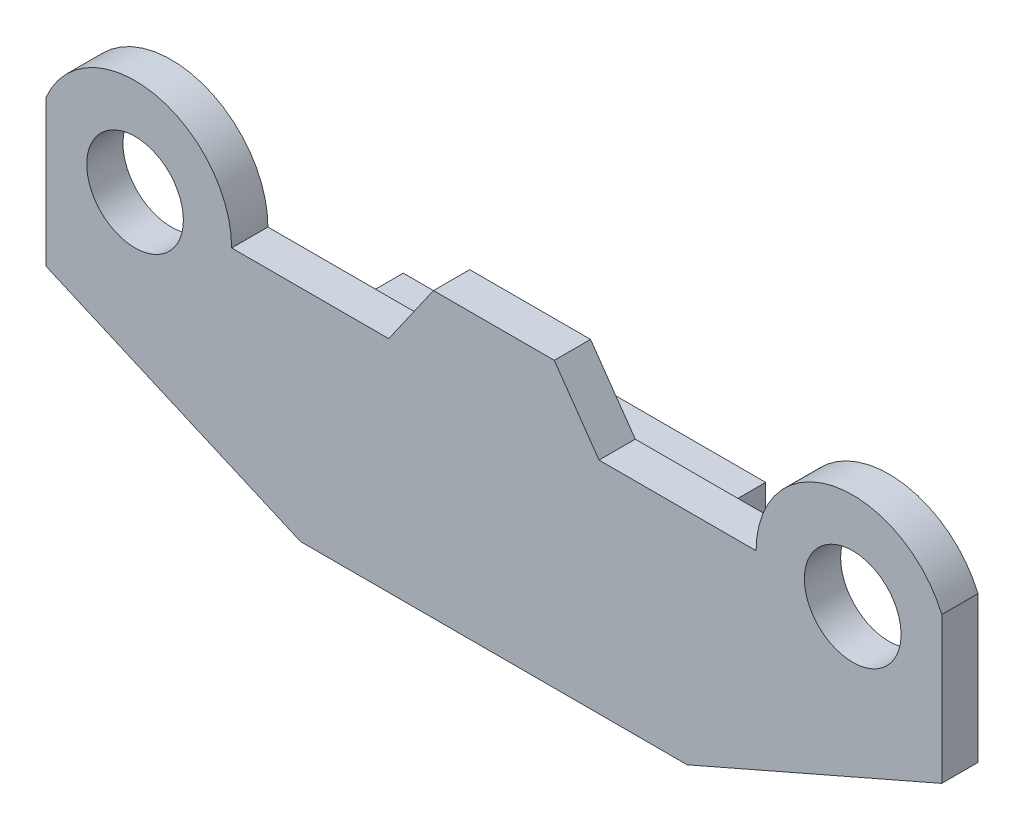
ISO-10303-21;
HEADER;
FILE_DESCRIPTION(('STEP AP214'),'2;1');
FILE_NAME('part.step','',(''),(''),'','','');
FILE_SCHEMA(('AUTOMOTIVE_DESIGN { 1 0 10303 214 1 1 1 1 }'));
ENDSEC;
DATA;
#1=APPLICATION_CONTEXT('core data for automotive mechanical design processes');
#2=APPLICATION_PROTOCOL_DEFINITION('international standard','automotive_design',2000,#1);
#3=PRODUCT_CONTEXT('',#1,'mechanical');
#4=PRODUCT('Part','Part','',(#3));
#5=PRODUCT_RELATED_PRODUCT_CATEGORY('part','',(#4));
#6=PRODUCT_DEFINITION_FORMATION('','',#4);
#7=PRODUCT_DEFINITION_CONTEXT('part definition',#1,'design');
#8=PRODUCT_DEFINITION('design','',#6,#7);
#9=PRODUCT_DEFINITION_SHAPE('','',#8);
#10=(LENGTH_UNIT() NAMED_UNIT(*) SI_UNIT(.MILLI.,.METRE.));
#11=(NAMED_UNIT(*) PLANE_ANGLE_UNIT() SI_UNIT($,.RADIAN.));
#12=(NAMED_UNIT(*) SI_UNIT($,.STERADIAN.) SOLID_ANGLE_UNIT());
#13=UNCERTAINTY_MEASURE_WITH_UNIT(LENGTH_MEASURE(1.E-05),#10,'distance_accuracy_value','');
#14=(GEOMETRIC_REPRESENTATION_CONTEXT(3) GLOBAL_UNCERTAINTY_ASSIGNED_CONTEXT((#13)) GLOBAL_UNIT_ASSIGNED_CONTEXT((#10,
#11,#12)) REPRESENTATION_CONTEXT('',''));
#15=CARTESIAN_POINT('',(0.,0.,0.));
#16=DIRECTION('',(0.,0.,1.));
#17=DIRECTION('',(1.,0.,0.));
#18=AXIS2_PLACEMENT_3D('',#15,#16,#17);
#19=CARTESIAN_POINT('',(-29.7060182427894,0.,3.));
#20=DIRECTION('',(0.,0.,1.));
#21=DIRECTION('',(1.,0.,0.));
#22=AXIS2_PLACEMENT_3D('',#19,#20,#21);
#23=PLANE('',#22);
#24=CARTESIAN_POINT('',(-29.7060182427894,0.,3.));
#25=DIRECTION('',(0.,0.,1.));
#26=DIRECTION('',(1.,0.,0.));
#27=AXIS2_PLACEMENT_3D('',#24,#25,#26);
#28=CIRCLE('',#27,4.);
#29=CARTESIAN_POINT('',(-25.7060182427894,0.,3.));
#30=VERTEX_POINT('',#29);
#31=EDGE_CURVE('E170',#30,#30,#28,.T.);
#32=ORIENTED_EDGE('',*,*,#31,.F.);
#33=EDGE_LOOP('',(#32));
#34=FACE_BOUND('',#33,.T.);
#35=CARTESIAN_POINT('',(-29.7060182427894,0.,3.));
#36=DIRECTION('',(0.,0.,1.));
#37=DIRECTION('',(1.,0.,0.));
#38=AXIS2_PLACEMENT_3D('',#35,#36,#37);
#39=CIRCLE('',#38,8.);
#40=CARTESIAN_POINT('',(-21.7060182427894,0.,3.));
#41=VERTEX_POINT('',#40);
#42=CARTESIAN_POINT('',(-37.0773842564028,3.10853069686384,3.));
#43=VERTEX_POINT('',#42);
#44=EDGE_CURVE('E190',#41,#43,#39,.T.);
#45=ORIENTED_EDGE('',*,*,#44,.T.);
#46=DIRECTION('',(0.,-1.,0.));
#47=VECTOR('',#46,1.);
#48=CARTESIAN_POINT('',(-37.0773842564028,3.10853069686384,3.));
#49=LINE('',#48,#47);
#50=CARTESIAN_POINT('',(-37.0773842564028,-8.99435646421489,3.));
#51=VERTEX_POINT('',#50);
#52=EDGE_CURVE('E110',#43,#51,#49,.T.);
#53=ORIENTED_EDGE('',*,*,#52,.T.);
#54=DIRECTION('',(0.916408011147949,-0.400245371121092,0.));
#55=VECTOR('',#54,1.);
#56=CARTESIAN_POINT('',(-37.0773842564028,-8.99435646421489,3.));
#57=LINE('',#56,#55);
#58=CARTESIAN_POINT('',(-16.,-18.2,3.));
#59=VERTEX_POINT('',#58);
#60=EDGE_CURVE('E217',#51,#59,#57,.T.);
#61=ORIENTED_EDGE('',*,*,#60,.T.);
#62=DIRECTION('',(1.,0.,0.));
#63=VECTOR('',#62,1.);
#64=CARTESIAN_POINT('',(-16.,-18.2,3.));
#65=LINE('',#64,#63);
#66=CARTESIAN_POINT('',(16.,-18.2,3.));
#67=VERTEX_POINT('',#66);
#68=EDGE_CURVE('E236',#59,#67,#65,.T.);
#69=ORIENTED_EDGE('',*,*,#68,.T.);
#70=DIRECTION('',(0.916408011147949,0.400245371121092,0.));
#71=VECTOR('',#70,1.);
#72=CARTESIAN_POINT('',(37.0773842564028,-8.99435646421489,3.));
#73=LINE('',#72,#71);
#74=CARTESIAN_POINT('',(37.0773842564028,-8.99435646421489,3.));
#75=VERTEX_POINT('',#74);
#76=EDGE_CURVE('E233',#67,#75,#73,.T.);
#77=ORIENTED_EDGE('',*,*,#76,.T.);
#78=DIRECTION('',(0.,1.,0.));
#79=VECTOR('',#78,1.);
#80=CARTESIAN_POINT('',(37.0773842564028,3.10853069686384,3.));
#81=LINE('',#80,#79);
#82=CARTESIAN_POINT('',(37.0773842564028,3.10853069686384,3.));
#83=VERTEX_POINT('',#82);
#84=EDGE_CURVE('E235',#75,#83,#81,.T.);
#85=ORIENTED_EDGE('',*,*,#84,.T.);
#86=CARTESIAN_POINT('',(29.7060182427894,0.,3.));
#87=DIRECTION('',(0.,0.,1.));
#88=DIRECTION('',(-1.,0.,0.));
#89=AXIS2_PLACEMENT_3D('',#86,#87,#88);
#90=CIRCLE('',#89,8.);
#91=CARTESIAN_POINT('',(21.7060182427894,0.,3.));
#92=VERTEX_POINT('',#91);
#93=EDGE_CURVE('E238',#83,#92,#90,.T.);
#94=ORIENTED_EDGE('',*,*,#93,.T.);
#95=DIRECTION('',(-1.,0.,0.));
#96=VECTOR('',#95,1.);
#97=CARTESIAN_POINT('',(21.7060182427894,0.,3.));
#98=LINE('',#97,#96);
#99=CARTESIAN_POINT('',(8.70601824278939,0.,3.));
#100=VERTEX_POINT('',#99);
#101=EDGE_CURVE('E244',#92,#100,#98,.T.);
#102=ORIENTED_EDGE('',*,*,#101,.T.);
#103=DIRECTION('',(-0.573049059575469,0.819521064597897,0.));
#104=VECTOR('',#103,1.);
#105=CARTESIAN_POINT('',(8.70601824278939,0.,3.));
#106=LINE('',#105,#104);
#107=CARTESIAN_POINT('',(5.,5.3,3.));
#108=VERTEX_POINT('',#107);
#109=EDGE_CURVE('E145',#100,#108,#106,.T.);
#110=ORIENTED_EDGE('',*,*,#109,.T.);
#111=DIRECTION('',(-1.,0.,0.));
#112=VECTOR('',#111,1.);
#113=CARTESIAN_POINT('',(-5.,5.3,3.));
#114=LINE('',#113,#112);
#115=CARTESIAN_POINT('',(-5.,5.3,3.));
#116=VERTEX_POINT('',#115);
#117=EDGE_CURVE('E138',#108,#116,#114,.T.);
#118=ORIENTED_EDGE('',*,*,#117,.T.);
#119=DIRECTION('',(-0.573049059575469,-0.819521064597897,0.));
#120=VECTOR('',#119,1.);
#121=CARTESIAN_POINT('',(-8.70601824278939,0.,3.));
#122=LINE('',#121,#120);
#123=CARTESIAN_POINT('',(-8.70601824278939,0.,3.));
#124=VERTEX_POINT('',#123);
#125=EDGE_CURVE('E142',#116,#124,#122,.T.);
#126=ORIENTED_EDGE('',*,*,#125,.T.);
#127=DIRECTION('',(-1.,0.,0.));
#128=VECTOR('',#127,1.);
#129=CARTESIAN_POINT('',(-21.7060182427894,0.,3.));
#130=LINE('',#129,#128);
#131=EDGE_CURVE('E57',#124,#41,#130,.T.);
#132=ORIENTED_EDGE('',*,*,#131,.T.);
#133=EDGE_LOOP('',(#45,#53,#61,#69,#77,#85,#94,#102,#110,#118,#126,#132));
#134=FACE_BOUND('',#133,.T.);
#135=CARTESIAN_POINT('',(29.7060182427894,0.,3.));
#136=DIRECTION('',(0.,0.,1.));
#137=DIRECTION('',(-1.,0.,0.));
#138=AXIS2_PLACEMENT_3D('',#135,#136,#137);
#139=CIRCLE('',#138,4.);
#140=CARTESIAN_POINT('',(25.7060182427894,0.,3.));
#141=VERTEX_POINT('',#140);
#142=EDGE_CURVE('E265',#141,#141,#139,.T.);
#143=ORIENTED_EDGE('',*,*,#142,.F.);
#144=EDGE_LOOP('',(#143));
#145=FACE_BOUND('',#144,.T.);
#146=ADVANCED_FACE('F33',(#34,#134,#145),#23,.T.);
#147=CARTESIAN_POINT('',(-29.7060182427894,0.,0.));
#148=DIRECTION('',(0.,0.,1.));
#149=DIRECTION('',(1.,0.,0.));
#150=AXIS2_PLACEMENT_3D('',#147,#148,#149);
#151=PLANE('',#150);
#152=DIRECTION('',(1.,0.,0.));
#153=VECTOR('',#152,1.);
#154=CARTESIAN_POINT('',(15.,-17.2,0.));
#155=LINE('',#154,#153);
#156=CARTESIAN_POINT('',(-15.,-17.2,0.));
#157=VERTEX_POINT('',#156);
#158=CARTESIAN_POINT('',(15.,-17.2,0.));
#159=VERTEX_POINT('',#158);
#160=EDGE_CURVE('E284',#157,#159,#155,.T.);
#161=ORIENTED_EDGE('',*,*,#160,.T.);
#162=DIRECTION('',(0.,1.,0.));
#163=VECTOR('',#162,1.);
#164=CARTESIAN_POINT('',(15.,-2.2,0.));
#165=LINE('',#164,#163);
#166=CARTESIAN_POINT('',(15.,-2.2,0.));
#167=VERTEX_POINT('',#166);
#168=EDGE_CURVE('E292',#159,#167,#165,.T.);
#169=ORIENTED_EDGE('',*,*,#168,.T.);
#170=DIRECTION('',(-1.,0.,0.));
#171=VECTOR('',#170,1.);
#172=CARTESIAN_POINT('',(15.,-2.2,0.));
#173=LINE('',#172,#171);
#174=CARTESIAN_POINT('',(-15.,-2.2,0.));
#175=VERTEX_POINT('',#174);
#176=EDGE_CURVE('E289',#167,#175,#173,.T.);
#177=ORIENTED_EDGE('',*,*,#176,.T.);
#178=DIRECTION('',(0.,-1.,0.));
#179=VECTOR('',#178,1.);
#180=CARTESIAN_POINT('',(-15.,-2.2,0.));
#181=LINE('',#180,#179);
#182=EDGE_CURVE('E48',#175,#157,#181,.T.);
#183=ORIENTED_EDGE('',*,*,#182,.T.);
#184=EDGE_LOOP('',(#161,#169,#177,#183));
#185=FACE_BOUND('',#184,.T.);
#186=CARTESIAN_POINT('',(-29.7060182427894,0.,0.));
#187=DIRECTION('',(0.,0.,1.));
#188=DIRECTION('',(1.,0.,0.));
#189=AXIS2_PLACEMENT_3D('',#186,#187,#188);
#190=CIRCLE('',#189,8.);
#191=CARTESIAN_POINT('',(-21.7060182427894,0.,0.));
#192=VERTEX_POINT('',#191);
#193=CARTESIAN_POINT('',(-37.0773842564028,3.10853069686384,0.));
#194=VERTEX_POINT('',#193);
#195=EDGE_CURVE('E166',#192,#194,#190,.T.);
#196=ORIENTED_EDGE('',*,*,#195,.F.);
#197=DIRECTION('',(-1.,0.,0.));
#198=VECTOR('',#197,1.);
#199=CARTESIAN_POINT('',(-21.7060182427894,0.,0.));
#200=LINE('',#199,#198);
#201=CARTESIAN_POINT('',(-8.70601824278939,0.,0.));
#202=VERTEX_POINT('',#201);
#203=EDGE_CURVE('E102',#202,#192,#200,.T.);
#204=ORIENTED_EDGE('',*,*,#203,.F.);
#205=DIRECTION('',(-0.573049059575469,-0.819521064597897,0.));
#206=VECTOR('',#205,1.);
#207=CARTESIAN_POINT('',(-8.70601824278939,0.,0.));
#208=LINE('',#207,#206);
#209=CARTESIAN_POINT('',(-5.,5.3,0.));
#210=VERTEX_POINT('',#209);
#211=EDGE_CURVE('E187',#210,#202,#208,.T.);
#212=ORIENTED_EDGE('',*,*,#211,.F.);
#213=DIRECTION('',(-1.,0.,0.));
#214=VECTOR('',#213,1.);
#215=CARTESIAN_POINT('',(-5.,5.3,0.));
#216=LINE('',#215,#214);
#217=CARTESIAN_POINT('',(5.,5.3,0.));
#218=VERTEX_POINT('',#217);
#219=EDGE_CURVE('E154',#218,#210,#216,.T.);
#220=ORIENTED_EDGE('',*,*,#219,.F.);
#221=DIRECTION('',(-0.573049059575469,0.819521064597897,0.));
#222=VECTOR('',#221,1.);
#223=CARTESIAN_POINT('',(8.70601824278939,0.,0.));
#224=LINE('',#223,#222);
#225=CARTESIAN_POINT('',(8.70601824278939,0.,0.));
#226=VERTEX_POINT('',#225);
#227=EDGE_CURVE('E184',#226,#218,#224,.T.);
#228=ORIENTED_EDGE('',*,*,#227,.F.);
#229=DIRECTION('',(-1.,0.,0.));
#230=VECTOR('',#229,1.);
#231=CARTESIAN_POINT('',(21.7060182427894,0.,0.));
#232=LINE('',#231,#230);
#233=CARTESIAN_POINT('',(21.7060182427894,0.,0.));
#234=VERTEX_POINT('',#233);
#235=EDGE_CURVE('E182',#234,#226,#232,.T.);
#236=ORIENTED_EDGE('',*,*,#235,.F.);
#237=CARTESIAN_POINT('',(29.7060182427894,0.,0.));
#238=DIRECTION('',(0.,0.,1.));
#239=DIRECTION('',(-1.,0.,0.));
#240=AXIS2_PLACEMENT_3D('',#237,#238,#239);
#241=CIRCLE('',#240,8.);
#242=CARTESIAN_POINT('',(37.0773842564028,3.10853069686384,0.));
#243=VERTEX_POINT('',#242);
#244=EDGE_CURVE('E180',#243,#234,#241,.T.);
#245=ORIENTED_EDGE('',*,*,#244,.F.);
#246=DIRECTION('',(0.,1.,0.));
#247=VECTOR('',#246,1.);
#248=CARTESIAN_POINT('',(37.0773842564028,3.10853069686384,0.));
#249=LINE('',#248,#247);
#250=CARTESIAN_POINT('',(37.0773842564028,-8.99435646421489,0.));
#251=VERTEX_POINT('',#250);
#252=EDGE_CURVE('E178',#251,#243,#249,.T.);
#253=ORIENTED_EDGE('',*,*,#252,.F.);
#254=DIRECTION('',(0.916408011147949,0.400245371121092,0.));
#255=VECTOR('',#254,1.);
#256=CARTESIAN_POINT('',(37.0773842564028,-8.99435646421489,0.));
#257=LINE('',#256,#255);
#258=CARTESIAN_POINT('',(16.,-18.2,0.));
#259=VERTEX_POINT('',#258);
#260=EDGE_CURVE('E176',#259,#251,#257,.T.);
#261=ORIENTED_EDGE('',*,*,#260,.F.);
#262=DIRECTION('',(1.,0.,0.));
#263=VECTOR('',#262,1.);
#264=CARTESIAN_POINT('',(-16.,-18.2,0.));
#265=LINE('',#264,#263);
#266=CARTESIAN_POINT('',(-16.,-18.2,0.));
#267=VERTEX_POINT('',#266);
#268=EDGE_CURVE('E174',#267,#259,#265,.T.);
#269=ORIENTED_EDGE('',*,*,#268,.F.);
#270=DIRECTION('',(0.916408011147949,-0.400245371121092,0.));
#271=VECTOR('',#270,1.);
#272=CARTESIAN_POINT('',(-37.0773842564028,-8.99435646421489,0.));
#273=LINE('',#272,#271);
#274=CARTESIAN_POINT('',(-37.0773842564028,-8.99435646421489,0.));
#275=VERTEX_POINT('',#274);
#276=EDGE_CURVE('E172',#275,#267,#273,.T.);
#277=ORIENTED_EDGE('',*,*,#276,.F.);
#278=DIRECTION('',(0.,-1.,0.));
#279=VECTOR('',#278,1.);
#280=CARTESIAN_POINT('',(-37.0773842564028,3.10853069686384,0.));
#281=LINE('',#280,#279);
#282=EDGE_CURVE('E169',#194,#275,#281,.T.);
#283=ORIENTED_EDGE('',*,*,#282,.F.);
#284=EDGE_LOOP('',(#196,#204,#212,#220,#228,#236,#245,#253,#261,#269,#277,#283));
#285=FACE_BOUND('',#284,.T.);
#286=CARTESIAN_POINT('',(-29.7060182427894,0.,0.));
#287=DIRECTION('',(0.,0.,1.));
#288=DIRECTION('',(1.,0.,0.));
#289=AXIS2_PLACEMENT_3D('',#286,#287,#288);
#290=CIRCLE('',#289,4.);
#291=CARTESIAN_POINT('',(-25.7060182427894,0.,0.));
#292=VERTEX_POINT('',#291);
#293=EDGE_CURVE('E262',#292,#292,#290,.T.);
#294=ORIENTED_EDGE('',*,*,#293,.T.);
#295=EDGE_LOOP('',(#294));
#296=FACE_BOUND('',#295,.T.);
#297=CARTESIAN_POINT('',(29.7060182427894,0.,0.));
#298=DIRECTION('',(0.,0.,1.));
#299=DIRECTION('',(-1.,0.,0.));
#300=AXIS2_PLACEMENT_3D('',#297,#298,#299);
#301=CIRCLE('',#300,4.);
#302=CARTESIAN_POINT('',(25.7060182427894,0.,0.));
#303=VERTEX_POINT('',#302);
#304=EDGE_CURVE('E268',#303,#303,#301,.T.);
#305=ORIENTED_EDGE('',*,*,#304,.T.);
#306=EDGE_LOOP('',(#305));
#307=FACE_BOUND('',#306,.T.);
#308=ADVANCED_FACE('F221',(#185,#285,#296,#307),#151,.F.);
#309=CARTESIAN_POINT('',(-29.7060182427894,0.,3.));
#310=DIRECTION('',(0.,0.,-1.));
#311=DIRECTION('',(-1.,0.,0.));
#312=AXIS2_PLACEMENT_3D('',#309,#310,#311);
#313=CYLINDRICAL_SURFACE('',#312,8.);
#314=ORIENTED_EDGE('',*,*,#195,.T.);
#315=DIRECTION('',(0.,0.,-1.));
#316=VECTOR('',#315,1.);
#317=CARTESIAN_POINT('',(-37.0773842564028,3.10853069686384,3.));
#318=LINE('',#317,#316);
#319=EDGE_CURVE('E11',#43,#194,#318,.T.);
#320=ORIENTED_EDGE('',*,*,#319,.F.);
#321=ORIENTED_EDGE('',*,*,#44,.F.);
#322=DIRECTION('',(0.,0.,-1.));
#323=VECTOR('',#322,1.);
#324=CARTESIAN_POINT('',(-21.7060182427894,0.,3.));
#325=LINE('',#324,#323);
#326=EDGE_CURVE('E162',#41,#192,#325,.T.);
#327=ORIENTED_EDGE('',*,*,#326,.T.);
#328=EDGE_LOOP('',(#314,#320,#321,#327));
#329=FACE_BOUND('',#328,.T.);
#330=ADVANCED_FACE('F35',(#329),#313,.T.);
#331=CARTESIAN_POINT('',(-37.0773842564028,3.10853069686384,3.));
#332=DIRECTION('',(1.,0.,0.));
#333=DIRECTION('',(0.,0.,-1.));
#334=AXIS2_PLACEMENT_3D('',#331,#332,#333);
#335=PLANE('',#334);
#336=ORIENTED_EDGE('',*,*,#282,.T.);
#337=DIRECTION('',(0.,0.,-1.));
#338=VECTOR('',#337,1.);
#339=CARTESIAN_POINT('',(-37.0773842564028,-8.99435646421489,3.));
#340=LINE('',#339,#338);
#341=EDGE_CURVE('E41',#51,#275,#340,.T.);
#342=ORIENTED_EDGE('',*,*,#341,.F.);
#343=ORIENTED_EDGE('',*,*,#52,.F.);
#344=ORIENTED_EDGE('',*,*,#319,.T.);
#345=EDGE_LOOP('',(#336,#342,#343,#344));
#346=FACE_BOUND('',#345,.T.);
#347=ADVANCED_FACE('F340',(#346),#335,.F.);
#348=CARTESIAN_POINT('',(-37.0773842564028,-8.99435646421489,3.));
#349=DIRECTION('',(0.400245371121092,0.916408011147949,0.));
#350=DIRECTION('',(-0.916408011147949,0.400245371121092,0.));
#351=AXIS2_PLACEMENT_3D('',#348,#349,#350);
#352=PLANE('',#351);
#353=ORIENTED_EDGE('',*,*,#276,.T.);
#354=DIRECTION('',(0.,0.,-1.));
#355=VECTOR('',#354,1.);
#356=CARTESIAN_POINT('',(-16.,-18.2,3.));
#357=LINE('',#356,#355);
#358=EDGE_CURVE('E209',#59,#267,#357,.T.);
#359=ORIENTED_EDGE('',*,*,#358,.F.);
#360=ORIENTED_EDGE('',*,*,#60,.F.);
#361=ORIENTED_EDGE('',*,*,#341,.T.);
#362=EDGE_LOOP('',(#353,#359,#360,#361));
#363=FACE_BOUND('',#362,.T.);
#364=ADVANCED_FACE('F215',(#363),#352,.F.);
#365=CARTESIAN_POINT('',(-16.,-18.2,3.));
#366=DIRECTION('',(0.,1.,0.));
#367=DIRECTION('',(0.,0.,1.));
#368=AXIS2_PLACEMENT_3D('',#365,#366,#367);
#369=PLANE('',#368);
#370=ORIENTED_EDGE('',*,*,#268,.T.);
#371=DIRECTION('',(0.,0.,-1.));
#372=VECTOR('',#371,1.);
#373=CARTESIAN_POINT('',(16.,-18.2,3.));
#374=LINE('',#373,#372);
#375=EDGE_CURVE('E206',#67,#259,#374,.T.);
#376=ORIENTED_EDGE('',*,*,#375,.F.);
#377=ORIENTED_EDGE('',*,*,#68,.F.);
#378=ORIENTED_EDGE('',*,*,#358,.T.);
#379=EDGE_LOOP('',(#370,#376,#377,#378));
#380=FACE_BOUND('',#379,.T.);
#381=ADVANCED_FACE('F227',(#380),#369,.F.);
#382=CARTESIAN_POINT('',(37.0773842564028,-8.99435646421489,3.));
#383=DIRECTION('',(-0.400245371121092,0.916408011147949,0.));
#384=DIRECTION('',(-0.916408011147949,-0.400245371121092,0.));
#385=AXIS2_PLACEMENT_3D('',#382,#383,#384);
#386=PLANE('',#385);
#387=ORIENTED_EDGE('',*,*,#260,.T.);
#388=DIRECTION('',(0.,0.,-1.));
#389=VECTOR('',#388,1.);
#390=CARTESIAN_POINT('',(37.0773842564028,-8.99435646421489,3.));
#391=LINE('',#390,#389);
#392=EDGE_CURVE('E203',#75,#251,#391,.T.);
#393=ORIENTED_EDGE('',*,*,#392,.F.);
#394=ORIENTED_EDGE('',*,*,#76,.F.);
#395=ORIENTED_EDGE('',*,*,#375,.T.);
#396=EDGE_LOOP('',(#387,#393,#394,#395));
#397=FACE_BOUND('',#396,.T.);
#398=ADVANCED_FACE('F231',(#397),#386,.F.);
#399=CARTESIAN_POINT('',(37.0773842564028,3.10853069686384,3.));
#400=DIRECTION('',(-1.,0.,0.));
#401=DIRECTION('',(0.,0.,1.));
#402=AXIS2_PLACEMENT_3D('',#399,#400,#401);
#403=PLANE('',#402);
#404=ORIENTED_EDGE('',*,*,#252,.T.);
#405=DIRECTION('',(0.,0.,-1.));
#406=VECTOR('',#405,1.);
#407=CARTESIAN_POINT('',(37.0773842564028,3.10853069686384,3.));
#408=LINE('',#407,#406);
#409=EDGE_CURVE('E200',#83,#243,#408,.T.);
#410=ORIENTED_EDGE('',*,*,#409,.F.);
#411=ORIENTED_EDGE('',*,*,#84,.F.);
#412=ORIENTED_EDGE('',*,*,#392,.T.);
#413=EDGE_LOOP('',(#404,#410,#411,#412));
#414=FACE_BOUND('',#413,.T.);
#415=ADVANCED_FACE('F359',(#414),#403,.F.);
#416=CARTESIAN_POINT('',(29.7060182427894,0.,3.));
#417=DIRECTION('',(0.,0.,-1.));
#418=DIRECTION('',(-1.,0.,0.));
#419=AXIS2_PLACEMENT_3D('',#416,#417,#418);
#420=CYLINDRICAL_SURFACE('',#419,8.);
#421=ORIENTED_EDGE('',*,*,#244,.T.);
#422=DIRECTION('',(0.,0.,-1.));
#423=VECTOR('',#422,1.);
#424=CARTESIAN_POINT('',(21.7060182427894,0.,3.));
#425=LINE('',#424,#423);
#426=EDGE_CURVE('E197',#92,#234,#425,.T.);
#427=ORIENTED_EDGE('',*,*,#426,.F.);
#428=ORIENTED_EDGE('',*,*,#93,.F.);
#429=ORIENTED_EDGE('',*,*,#409,.T.);
#430=EDGE_LOOP('',(#421,#427,#428,#429));
#431=FACE_BOUND('',#430,.T.);
#432=ADVANCED_FACE('F356',(#431),#420,.T.);
#433=CARTESIAN_POINT('',(21.7060182427894,0.,3.));
#434=DIRECTION('',(0.,-1.,0.));
#435=DIRECTION('',(0.,0.,-1.));
#436=AXIS2_PLACEMENT_3D('',#433,#434,#435);
#437=PLANE('',#436);
#438=ORIENTED_EDGE('',*,*,#235,.T.);
#439=DIRECTION('',(0.,0.,-1.));
#440=VECTOR('',#439,1.);
#441=CARTESIAN_POINT('',(8.70601824278939,0.,3.));
#442=LINE('',#441,#440);
#443=EDGE_CURVE('E194',#100,#226,#442,.T.);
#444=ORIENTED_EDGE('',*,*,#443,.F.);
#445=ORIENTED_EDGE('',*,*,#101,.F.);
#446=ORIENTED_EDGE('',*,*,#426,.T.);
#447=EDGE_LOOP('',(#438,#444,#445,#446));
#448=FACE_BOUND('',#447,.T.);
#449=ADVANCED_FACE('F250',(#448),#437,.F.);
#450=CARTESIAN_POINT('',(8.70601824278939,0.,3.));
#451=DIRECTION('',(-0.819521064597897,-0.573049059575469,0.));
#452=DIRECTION('',(0.573049059575469,-0.819521064597897,0.));
#453=AXIS2_PLACEMENT_3D('',#450,#451,#452);
#454=PLANE('',#453);
#455=ORIENTED_EDGE('',*,*,#227,.T.);
#456=DIRECTION('',(0.,0.,-1.));
#457=VECTOR('',#456,1.);
#458=CARTESIAN_POINT('',(5.,5.3,3.));
#459=LINE('',#458,#457);
#460=EDGE_CURVE('E157',#108,#218,#459,.T.);
#461=ORIENTED_EDGE('',*,*,#460,.F.);
#462=ORIENTED_EDGE('',*,*,#109,.F.);
#463=ORIENTED_EDGE('',*,*,#443,.T.);
#464=EDGE_LOOP('',(#455,#461,#462,#463));
#465=FACE_BOUND('',#464,.T.);
#466=ADVANCED_FACE('F254',(#465),#454,.F.);
#467=CARTESIAN_POINT('',(-5.,5.3,3.));
#468=DIRECTION('',(0.,-1.,0.));
#469=DIRECTION('',(0.,0.,-1.));
#470=AXIS2_PLACEMENT_3D('',#467,#468,#469);
#471=PLANE('',#470);
#472=ORIENTED_EDGE('',*,*,#219,.T.);
#473=DIRECTION('',(0.,0.,-1.));
#474=VECTOR('',#473,1.);
#475=CARTESIAN_POINT('',(-5.,5.3,3.));
#476=LINE('',#475,#474);
#477=EDGE_CURVE('E151',#116,#210,#476,.T.);
#478=ORIENTED_EDGE('',*,*,#477,.F.);
#479=ORIENTED_EDGE('',*,*,#117,.F.);
#480=ORIENTED_EDGE('',*,*,#460,.T.);
#481=EDGE_LOOP('',(#472,#478,#479,#480));
#482=FACE_BOUND('',#481,.T.);
#483=ADVANCED_FACE('F152',(#482),#471,.F.);
#484=CARTESIAN_POINT('',(-8.70601824278939,0.,3.));
#485=DIRECTION('',(0.819521064597897,-0.573049059575469,0.));
#486=DIRECTION('',(0.573049059575469,0.819521064597897,0.));
#487=AXIS2_PLACEMENT_3D('',#484,#485,#486);
#488=PLANE('',#487);
#489=ORIENTED_EDGE('',*,*,#211,.T.);
#490=DIRECTION('',(0.,0.,-1.));
#491=VECTOR('',#490,1.);
#492=CARTESIAN_POINT('',(-8.70601824278939,0.,3.));
#493=LINE('',#492,#491);
#494=EDGE_CURVE('E158',#124,#202,#493,.T.);
#495=ORIENTED_EDGE('',*,*,#494,.F.);
#496=ORIENTED_EDGE('',*,*,#125,.F.);
#497=ORIENTED_EDGE('',*,*,#477,.T.);
#498=EDGE_LOOP('',(#489,#495,#496,#497));
#499=FACE_BOUND('',#498,.T.);
#500=ADVANCED_FACE('F160',(#499),#488,.F.);
#501=CARTESIAN_POINT('',(-21.7060182427894,0.,3.));
#502=DIRECTION('',(0.,-1.,0.));
#503=DIRECTION('',(0.,0.,-1.));
#504=AXIS2_PLACEMENT_3D('',#501,#502,#503);
#505=PLANE('',#504);
#506=ORIENTED_EDGE('',*,*,#203,.T.);
#507=ORIENTED_EDGE('',*,*,#326,.F.);
#508=ORIENTED_EDGE('',*,*,#131,.F.);
#509=ORIENTED_EDGE('',*,*,#494,.T.);
#510=EDGE_LOOP('',(#506,#507,#508,#509));
#511=FACE_BOUND('',#510,.T.);
#512=ADVANCED_FACE('F255',(#511),#505,.F.);
#513=CARTESIAN_POINT('',(-29.7060182427894,0.,3.));
#514=DIRECTION('',(0.,0.,-1.));
#515=DIRECTION('',(-1.,0.,0.));
#516=AXIS2_PLACEMENT_3D('',#513,#514,#515);
#517=CYLINDRICAL_SURFACE('',#516,4.);
#518=ORIENTED_EDGE('',*,*,#31,.T.);
#519=EDGE_LOOP('',(#518));
#520=FACE_BOUND('',#519,.T.);
#521=ORIENTED_EDGE('',*,*,#293,.F.);
#522=EDGE_LOOP('',(#521));
#523=FACE_BOUND('',#522,.T.);
#524=ADVANCED_FACE('F347',(#520,#523),#517,.F.);
#525=CARTESIAN_POINT('',(29.7060182427894,0.,3.));
#526=DIRECTION('',(0.,0.,-1.));
#527=DIRECTION('',(-1.,0.,0.));
#528=AXIS2_PLACEMENT_3D('',#525,#526,#527);
#529=CYLINDRICAL_SURFACE('',#528,4.);
#530=ORIENTED_EDGE('',*,*,#142,.T.);
#531=EDGE_LOOP('',(#530));
#532=FACE_BOUND('',#531,.T.);
#533=ORIENTED_EDGE('',*,*,#304,.F.);
#534=EDGE_LOOP('',(#533));
#535=FACE_BOUND('',#534,.T.);
#536=ADVANCED_FACE('F420',(#532,#535),#529,.F.);
#537=CARTESIAN_POINT('',(15.,-2.2,-4.5));
#538=DIRECTION('',(1.,0.,0.));
#539=DIRECTION('',(0.,1.,0.));
#540=AXIS2_PLACEMENT_3D('',#537,#538,#539);
#541=PLANE('',#540);
#542=ORIENTED_EDGE('',*,*,#168,.F.);
#543=DIRECTION('',(0.,0.,1.));
#544=VECTOR('',#543,1.);
#545=CARTESIAN_POINT('',(15.,-17.2,-4.5));
#546=LINE('',#545,#544);
#547=CARTESIAN_POINT('',(15.,-17.2,-4.5));
#548=VERTEX_POINT('',#547);
#549=EDGE_CURVE('E271',#548,#159,#546,.T.);
#550=ORIENTED_EDGE('',*,*,#549,.F.);
#551=DIRECTION('',(0.,1.,0.));
#552=VECTOR('',#551,1.);
#553=CARTESIAN_POINT('',(15.,-2.2,-4.5));
#554=LINE('',#553,#552);
#555=CARTESIAN_POINT('',(15.,-2.2,-4.5));
#556=VERTEX_POINT('',#555);
#557=EDGE_CURVE('E287',#548,#556,#554,.T.);
#558=ORIENTED_EDGE('',*,*,#557,.T.);
#559=DIRECTION('',(0.,0.,1.));
#560=VECTOR('',#559,1.);
#561=CARTESIAN_POINT('',(15.,-2.2,-4.5));
#562=LINE('',#561,#560);
#563=EDGE_CURVE('E274',#556,#167,#562,.T.);
#564=ORIENTED_EDGE('',*,*,#563,.T.);
#565=EDGE_LOOP('',(#542,#550,#558,#564));
#566=FACE_BOUND('',#565,.T.);
#567=ADVANCED_FACE('F309',(#566),#541,.T.);
#568=CARTESIAN_POINT('',(15.,-17.2,-4.5));
#569=DIRECTION('',(0.,-1.,0.));
#570=DIRECTION('',(1.,0.,0.));
#571=AXIS2_PLACEMENT_3D('',#568,#569,#570);
#572=PLANE('',#571);
#573=ORIENTED_EDGE('',*,*,#160,.F.);
#574=DIRECTION('',(0.,0.,1.));
#575=VECTOR('',#574,1.);
#576=CARTESIAN_POINT('',(-15.,-17.2,-4.5));
#577=LINE('',#576,#575);
#578=CARTESIAN_POINT('',(-15.,-17.2,-4.5));
#579=VERTEX_POINT('',#578);
#580=EDGE_CURVE('E280',#579,#157,#577,.T.);
#581=ORIENTED_EDGE('',*,*,#580,.F.);
#582=DIRECTION('',(1.,0.,0.));
#583=VECTOR('',#582,1.);
#584=CARTESIAN_POINT('',(15.,-17.2,-4.5));
#585=LINE('',#584,#583);
#586=EDGE_CURVE('E278',#579,#548,#585,.T.);
#587=ORIENTED_EDGE('',*,*,#586,.T.);
#588=ORIENTED_EDGE('',*,*,#549,.T.);
#589=EDGE_LOOP('',(#573,#581,#587,#588));
#590=FACE_BOUND('',#589,.T.);
#591=ADVANCED_FACE('F325',(#590),#572,.T.);
#592=CARTESIAN_POINT('',(-15.,-2.2,-4.5));
#593=DIRECTION('',(-1.,0.,0.));
#594=DIRECTION('',(0.,-1.,0.));
#595=AXIS2_PLACEMENT_3D('',#592,#593,#594);
#596=PLANE('',#595);
#597=ORIENTED_EDGE('',*,*,#182,.F.);
#598=DIRECTION('',(0.,0.,1.));
#599=VECTOR('',#598,1.);
#600=CARTESIAN_POINT('',(-15.,-2.2,-4.5));
#601=LINE('',#600,#599);
#602=CARTESIAN_POINT('',(-15.,-2.2,-4.5));
#603=VERTEX_POINT('',#602);
#604=EDGE_CURVE('E277',#603,#175,#601,.T.);
#605=ORIENTED_EDGE('',*,*,#604,.F.);
#606=DIRECTION('',(0.,-1.,0.));
#607=VECTOR('',#606,1.);
#608=CARTESIAN_POINT('',(-15.,-2.2,-4.5));
#609=LINE('',#608,#607);
#610=EDGE_CURVE('E297',#603,#579,#609,.T.);
#611=ORIENTED_EDGE('',*,*,#610,.T.);
#612=ORIENTED_EDGE('',*,*,#580,.T.);
#613=EDGE_LOOP('',(#597,#605,#611,#612));
#614=FACE_BOUND('',#613,.T.);
#615=ADVANCED_FACE('F328',(#614),#596,.T.);
#616=CARTESIAN_POINT('',(15.,-2.2,-4.5));
#617=DIRECTION('',(0.,1.,0.));
#618=DIRECTION('',(-1.,0.,0.));
#619=AXIS2_PLACEMENT_3D('',#616,#617,#618);
#620=PLANE('',#619);
#621=ORIENTED_EDGE('',*,*,#176,.F.);
#622=ORIENTED_EDGE('',*,*,#563,.F.);
#623=DIRECTION('',(-1.,0.,0.));
#624=VECTOR('',#623,1.);
#625=CARTESIAN_POINT('',(15.,-2.2,-4.5));
#626=LINE('',#625,#624);
#627=EDGE_CURVE('E300',#556,#603,#626,.T.);
#628=ORIENTED_EDGE('',*,*,#627,.T.);
#629=ORIENTED_EDGE('',*,*,#604,.T.);
#630=EDGE_LOOP('',(#621,#622,#628,#629));
#631=FACE_BOUND('',#630,.T.);
#632=ADVANCED_FACE('F331',(#631),#620,.T.);
#633=CARTESIAN_POINT('',(0.,0.,-4.5));
#634=DIRECTION('',(0.,0.,-1.));
#635=DIRECTION('',(-1.,0.,0.));
#636=AXIS2_PLACEMENT_3D('',#633,#634,#635);
#637=PLANE('',#636);
#638=ORIENTED_EDGE('',*,*,#557,.F.);
#639=ORIENTED_EDGE('',*,*,#586,.F.);
#640=ORIENTED_EDGE('',*,*,#610,.F.);
#641=ORIENTED_EDGE('',*,*,#627,.F.);
#642=EDGE_LOOP('',(#638,#639,#640,#641));
#643=FACE_BOUND('',#642,.T.);
#644=ADVANCED_FACE('F318',(#643),#637,.T.);
#645=CLOSED_SHELL('',(#146,#308,#330,#347,#364,#381,#398,#415,#432,#449,#466,#483,#500,#512,
#524,#536,#567,#591,#615,#632,#644));
#646=MANIFOLD_SOLID_BREP('B2',#645);
#647=ADVANCED_BREP_SHAPE_REPRESENTATION('',(#18,#646),#14);
#648=SHAPE_DEFINITION_REPRESENTATION(#9,#647);
ENDSEC;
END-ISO-10303-21;
